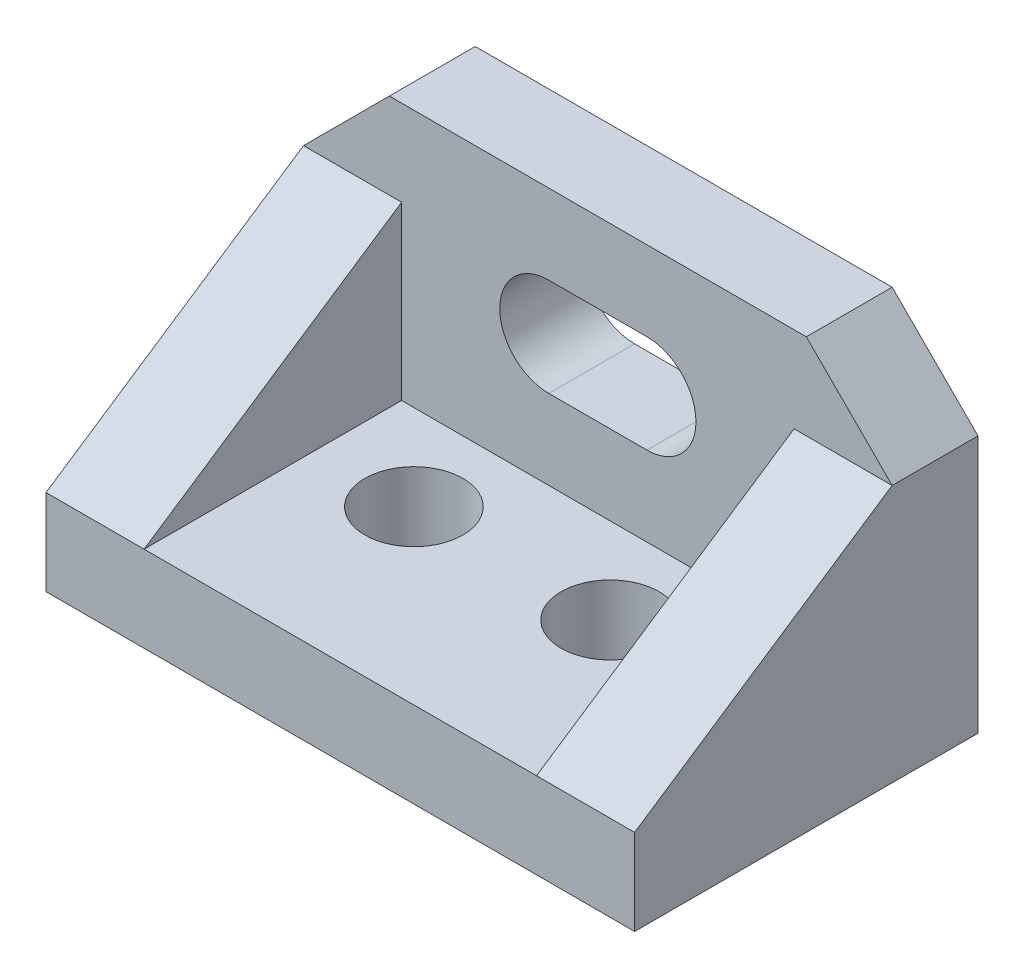
ISO-10303-21;
HEADER;
FILE_DESCRIPTION(('STEP AP214'),'2;1');
FILE_NAME('part.step','',(''),(''),'','','');
FILE_SCHEMA(('AUTOMOTIVE_DESIGN { 1 0 10303 214 1 1 1 1 }'));
ENDSEC;
DATA;
#1=APPLICATION_CONTEXT('core data for automotive mechanical design processes');
#2=APPLICATION_PROTOCOL_DEFINITION('international standard','automotive_design',2000,#1);
#3=PRODUCT_CONTEXT('',#1,'mechanical');
#4=PRODUCT('Part','Part','',(#3));
#5=PRODUCT_RELATED_PRODUCT_CATEGORY('part','',(#4));
#6=PRODUCT_DEFINITION_FORMATION('','',#4);
#7=PRODUCT_DEFINITION_CONTEXT('part definition',#1,'design');
#8=PRODUCT_DEFINITION('design','',#6,#7);
#9=PRODUCT_DEFINITION_SHAPE('','',#8);
#10=(LENGTH_UNIT() NAMED_UNIT(*) SI_UNIT(.MILLI.,.METRE.));
#11=(NAMED_UNIT(*) PLANE_ANGLE_UNIT() SI_UNIT($,.RADIAN.));
#12=(NAMED_UNIT(*) SI_UNIT($,.STERADIAN.) SOLID_ANGLE_UNIT());
#13=UNCERTAINTY_MEASURE_WITH_UNIT(LENGTH_MEASURE(1.E-05),#10,'distance_accuracy_value','');
#14=(GEOMETRIC_REPRESENTATION_CONTEXT(3) GLOBAL_UNCERTAINTY_ASSIGNED_CONTEXT((#13)) GLOBAL_UNIT_ASSIGNED_CONTEXT((#10,
#11,#12)) REPRESENTATION_CONTEXT('',''));
#15=CARTESIAN_POINT('',(0.,0.,0.));
#16=DIRECTION('',(0.,0.,1.));
#17=DIRECTION('',(1.,0.,0.));
#18=AXIS2_PLACEMENT_3D('',#15,#16,#17);
#19=CARTESIAN_POINT('',(0.,22.225,0.));
#20=DIRECTION('',(0.,-1.,0.));
#21=DIRECTION('',(0.,0.,-1.));
#22=AXIS2_PLACEMENT_3D('',#19,#20,#21);
#23=PLANE('',#22);
#24=CARTESIAN_POINT('',(50.8,22.225,-44.45));
#25=DIRECTION('',(0.,1.,0.));
#26=DIRECTION('',(0.,0.,1.));
#27=AXIS2_PLACEMENT_3D('',#24,#25,#26);
#28=CIRCLE('',#27,12.7);
#29=CARTESIAN_POINT('',(50.8,22.225,-31.75));
#30=VERTEX_POINT('',#29);
#31=EDGE_CURVE('E199',#30,#30,#28,.T.);
#32=ORIENTED_EDGE('',*,*,#31,.F.);
#33=EDGE_LOOP('',(#32));
#34=FACE_BOUND('',#33,.T.);
#35=CARTESIAN_POINT('',(101.6,22.225,-44.45));
#36=DIRECTION('',(0.,1.,0.));
#37=DIRECTION('',(0.,0.,1.));
#38=AXIS2_PLACEMENT_3D('',#35,#36,#37);
#39=CIRCLE('',#38,12.7);
#40=CARTESIAN_POINT('',(101.6,22.225,-31.75));
#41=VERTEX_POINT('',#40);
#42=EDGE_CURVE('E203',#41,#41,#39,.T.);
#43=ORIENTED_EDGE('',*,*,#42,.F.);
#44=EDGE_LOOP('',(#43));
#45=FACE_BOUND('',#44,.T.);
#46=DIRECTION('',(1.,0.,0.));
#47=VECTOR('',#46,1.);
#48=CARTESIAN_POINT('',(0.,22.225,-66.675));
#49=LINE('',#48,#47);
#50=CARTESIAN_POINT('',(25.4,22.225,-66.675));
#51=VERTEX_POINT('',#50);
#52=CARTESIAN_POINT('',(127.,22.225,-66.675));
#53=VERTEX_POINT('',#52);
#54=EDGE_CURVE('E235',#51,#53,#49,.T.);
#55=ORIENTED_EDGE('',*,*,#54,.F.);
#56=DIRECTION('',(0.,0.,-1.));
#57=VECTOR('',#56,1.);
#58=CARTESIAN_POINT('',(25.4,22.225,0.));
#59=LINE('',#58,#57);
#60=CARTESIAN_POINT('',(25.4,22.225,0.));
#61=VERTEX_POINT('',#60);
#62=EDGE_CURVE('E277',#61,#51,#59,.T.);
#63=ORIENTED_EDGE('',*,*,#62,.F.);
#64=DIRECTION('',(1.,0.,0.));
#65=VECTOR('',#64,1.);
#66=CARTESIAN_POINT('',(152.4,22.225,0.));
#67=LINE('',#66,#65);
#68=CARTESIAN_POINT('',(127.,22.225,0.));
#69=VERTEX_POINT('',#68);
#70=EDGE_CURVE('E292',#61,#69,#67,.T.);
#71=ORIENTED_EDGE('',*,*,#70,.T.);
#72=DIRECTION('',(0.,0.,1.));
#73=VECTOR('',#72,1.);
#74=CARTESIAN_POINT('',(127.,22.225,-66.675));
#75=LINE('',#74,#73);
#76=EDGE_CURVE('E273',#53,#69,#75,.T.);
#77=ORIENTED_EDGE('',*,*,#76,.F.);
#78=EDGE_LOOP('',(#55,#63,#71,#77));
#79=FACE_BOUND('',#78,.T.);
#80=ADVANCED_FACE('F45',(#34,#45,#79),#23,.F.);
#81=CARTESIAN_POINT('',(152.4,22.225,0.));
#82=DIRECTION('',(0.,0.,-1.));
#83=DIRECTION('',(-1.,0.,0.));
#84=AXIS2_PLACEMENT_3D('',#81,#82,#83);
#85=PLANE('',#84);
#86=DIRECTION('',(0.,-1.,0.));
#87=VECTOR('',#86,1.);
#88=CARTESIAN_POINT('',(152.4,22.225,0.));
#89=LINE('',#88,#87);
#90=CARTESIAN_POINT('',(152.4,22.225,0.));
#91=VERTEX_POINT('',#90);
#92=CARTESIAN_POINT('',(152.4,0.,0.));
#93=VERTEX_POINT('',#92);
#94=EDGE_CURVE('E11',#91,#93,#89,.T.);
#95=ORIENTED_EDGE('',*,*,#94,.F.);
#96=DIRECTION('',(1.,0.,0.));
#97=VECTOR('',#96,1.);
#98=CARTESIAN_POINT('',(0.,22.225,0.));
#99=LINE('',#98,#97);
#100=EDGE_CURVE('E253',#69,#91,#99,.T.);
#101=ORIENTED_EDGE('',*,*,#100,.F.);
#102=ORIENTED_EDGE('',*,*,#70,.F.);
#103=CARTESIAN_POINT('',(0.,22.225,0.));
#104=VERTEX_POINT('',#103);
#105=EDGE_CURVE('E257',#104,#61,#99,.T.);
#106=ORIENTED_EDGE('',*,*,#105,.F.);
#107=DIRECTION('',(0.,-1.,0.));
#108=VECTOR('',#107,1.);
#109=CARTESIAN_POINT('',(0.,22.225,0.));
#110=LINE('',#109,#108);
#111=CARTESIAN_POINT('',(0.,0.,0.));
#112=VERTEX_POINT('',#111);
#113=EDGE_CURVE('E296',#104,#112,#110,.T.);
#114=ORIENTED_EDGE('',*,*,#113,.T.);
#115=DIRECTION('',(1.,0.,0.));
#116=VECTOR('',#115,1.);
#117=CARTESIAN_POINT('',(152.4,0.,0.));
#118=LINE('',#117,#116);
#119=EDGE_CURVE('E291',#112,#93,#118,.T.);
#120=ORIENTED_EDGE('',*,*,#119,.T.);
#121=EDGE_LOOP('',(#95,#101,#102,#106,#114,#120));
#122=FACE_BOUND('',#121,.T.);
#123=ADVANCED_FACE('F47',(#122),#85,.F.);
#124=CARTESIAN_POINT('',(152.4,22.225,-88.9));
#125=DIRECTION('',(-1.,0.,0.));
#126=DIRECTION('',(0.,0.,1.));
#127=AXIS2_PLACEMENT_3D('',#124,#125,#126);
#128=PLANE('',#127);
#129=DIRECTION('',(0.,-1.,0.));
#130=VECTOR('',#129,1.);
#131=CARTESIAN_POINT('',(152.4,22.225,-88.9));
#132=LINE('',#131,#130);
#133=CARTESIAN_POINT('',(152.4,66.675,-88.9));
#134=VERTEX_POINT('',#133);
#135=CARTESIAN_POINT('',(152.4,0.,-88.9));
#136=VERTEX_POINT('',#135);
#137=EDGE_CURVE('E54',#134,#136,#132,.T.);
#138=ORIENTED_EDGE('',*,*,#137,.F.);
#139=DIRECTION('',(0.,0.,1.));
#140=VECTOR('',#139,1.);
#141=CARTESIAN_POINT('',(152.4,66.675,-88.9));
#142=LINE('',#141,#140);
#143=CARTESIAN_POINT('',(152.4,66.675,-66.675));
#144=VERTEX_POINT('',#143);
#145=EDGE_CURVE('E228',#134,#144,#142,.T.);
#146=ORIENTED_EDGE('',*,*,#145,.T.);
#147=DIRECTION('',(0.,0.554700196225229,-0.832050294337844));
#148=VECTOR('',#147,1.);
#149=CARTESIAN_POINT('',(152.4,66.675,-66.675));
#150=LINE('',#149,#148);
#151=EDGE_CURVE('E246',#91,#144,#150,.T.);
#152=ORIENTED_EDGE('',*,*,#151,.F.);
#153=ORIENTED_EDGE('',*,*,#94,.T.);
#154=DIRECTION('',(0.,0.,-1.));
#155=VECTOR('',#154,1.);
#156=CARTESIAN_POINT('',(152.4,0.,-88.9));
#157=LINE('',#156,#155);
#158=EDGE_CURVE('E301',#93,#136,#157,.T.);
#159=ORIENTED_EDGE('',*,*,#158,.T.);
#160=EDGE_LOOP('',(#138,#146,#152,#153,#159));
#161=FACE_BOUND('',#160,.T.);
#162=ADVANCED_FACE('F327',(#161),#128,.F.);
#163=CARTESIAN_POINT('',(0.,22.225,-88.9));
#164=DIRECTION('',(0.,0.,1.));
#165=DIRECTION('',(1.,0.,0.));
#166=AXIS2_PLACEMENT_3D('',#163,#164,#165);
#167=PLANE('',#166);
#168=CARTESIAN_POINT('',(63.5,55.5625,-88.9));
#169=DIRECTION('',(0.,0.,1.));
#170=DIRECTION('',(1.,0.,0.));
#171=AXIS2_PLACEMENT_3D('',#168,#169,#170);
#172=CIRCLE('',#171,12.7);
#173=CARTESIAN_POINT('',(63.5,68.2625,-88.9));
#174=VERTEX_POINT('',#173);
#175=CARTESIAN_POINT('',(63.5,42.8625,-88.9));
#176=VERTEX_POINT('',#175);
#177=EDGE_CURVE('E152',#174,#176,#172,.T.);
#178=ORIENTED_EDGE('',*,*,#177,.T.);
#179=DIRECTION('',(1.,0.,0.));
#180=VECTOR('',#179,1.);
#181=CARTESIAN_POINT('',(0.,42.8625,-88.9));
#182=LINE('',#181,#180);
#183=CARTESIAN_POINT('',(88.9,42.8625,-88.9));
#184=VERTEX_POINT('',#183);
#185=EDGE_CURVE('E148',#176,#184,#182,.T.);
#186=ORIENTED_EDGE('',*,*,#185,.T.);
#187=CARTESIAN_POINT('',(88.9,55.5625,-88.9));
#188=DIRECTION('',(0.,0.,1.));
#189=DIRECTION('',(1.,0.,0.));
#190=AXIS2_PLACEMENT_3D('',#187,#188,#189);
#191=CIRCLE('',#190,12.7);
#192=CARTESIAN_POINT('',(88.9,68.2625,-88.9));
#193=VERTEX_POINT('',#192);
#194=EDGE_CURVE('E155',#184,#193,#191,.T.);
#195=ORIENTED_EDGE('',*,*,#194,.T.);
#196=DIRECTION('',(1.,0.,0.));
#197=VECTOR('',#196,1.);
#198=CARTESIAN_POINT('',(0.,68.2625,-88.9));
#199=LINE('',#198,#197);
#200=EDGE_CURVE('E160',#174,#193,#199,.T.);
#201=ORIENTED_EDGE('',*,*,#200,.F.);
#202=EDGE_LOOP('',(#178,#186,#195,#201));
#203=FACE_BOUND('',#202,.T.);
#204=DIRECTION('',(0.,-1.,0.));
#205=VECTOR('',#204,1.);
#206=CARTESIAN_POINT('',(0.,22.225,-88.9));
#207=LINE('',#206,#205);
#208=CARTESIAN_POINT('',(0.,66.675,-88.9));
#209=VERTEX_POINT('',#208);
#210=CARTESIAN_POINT('',(0.,0.,-88.9));
#211=VERTEX_POINT('',#210);
#212=EDGE_CURVE('E314',#209,#211,#207,.T.);
#213=ORIENTED_EDGE('',*,*,#212,.F.);
#214=DIRECTION('',(0.707106781186546,0.707106781186549,0.));
#215=VECTOR('',#214,1.);
#216=CARTESIAN_POINT('',(22.2249999999999,88.9,-88.9));
#217=LINE('',#216,#215);
#218=CARTESIAN_POINT('',(22.2249999999999,88.9,-88.9));
#219=VERTEX_POINT('',#218);
#220=EDGE_CURVE('E210',#209,#219,#217,.T.);
#221=ORIENTED_EDGE('',*,*,#220,.T.);
#222=DIRECTION('',(-1.,0.,0.));
#223=VECTOR('',#222,1.);
#224=CARTESIAN_POINT('',(152.4,88.9,-88.9));
#225=LINE('',#224,#223);
#226=CARTESIAN_POINT('',(130.175,88.9,-88.9));
#227=VERTEX_POINT('',#226);
#228=EDGE_CURVE('E239',#227,#219,#225,.T.);
#229=ORIENTED_EDGE('',*,*,#228,.F.);
#230=DIRECTION('',(0.707106781186551,-0.707106781186543,0.));
#231=VECTOR('',#230,1.);
#232=CARTESIAN_POINT('',(130.175,88.9,-88.9));
#233=LINE('',#232,#231);
#234=EDGE_CURVE('E224',#227,#134,#233,.T.);
#235=ORIENTED_EDGE('',*,*,#234,.T.);
#236=ORIENTED_EDGE('',*,*,#137,.T.);
#237=DIRECTION('',(-1.,0.,0.));
#238=VECTOR('',#237,1.);
#239=CARTESIAN_POINT('',(0.,0.,-88.9));
#240=LINE('',#239,#238);
#241=EDGE_CURVE('E305',#136,#211,#240,.T.);
#242=ORIENTED_EDGE('',*,*,#241,.T.);
#243=EDGE_LOOP('',(#213,#221,#229,#235,#236,#242));
#244=FACE_BOUND('',#243,.T.);
#245=ADVANCED_FACE('F162',(#203,#244),#167,.F.);
#246=CARTESIAN_POINT('',(0.,22.225,0.));
#247=DIRECTION('',(1.,0.,0.));
#248=DIRECTION('',(0.,0.,-1.));
#249=AXIS2_PLACEMENT_3D('',#246,#247,#248);
#250=PLANE('',#249);
#251=DIRECTION('',(0.,0.554700196225229,-0.832050294337844));
#252=VECTOR('',#251,1.);
#253=CARTESIAN_POINT('',(0.,66.675,-66.675));
#254=LINE('',#253,#252);
#255=CARTESIAN_POINT('',(0.,66.675,-66.675));
#256=VERTEX_POINT('',#255);
#257=EDGE_CURVE('E249',#104,#256,#254,.T.);
#258=ORIENTED_EDGE('',*,*,#257,.T.);
#259=DIRECTION('',(0.,0.,1.));
#260=VECTOR('',#259,1.);
#261=CARTESIAN_POINT('',(0.,66.675,-88.9));
#262=LINE('',#261,#260);
#263=EDGE_CURVE('E214',#209,#256,#262,.T.);
#264=ORIENTED_EDGE('',*,*,#263,.F.);
#265=ORIENTED_EDGE('',*,*,#212,.T.);
#266=DIRECTION('',(0.,0.,1.));
#267=VECTOR('',#266,1.);
#268=CARTESIAN_POINT('',(0.,0.,0.));
#269=LINE('',#268,#267);
#270=EDGE_CURVE('E297',#211,#112,#269,.T.);
#271=ORIENTED_EDGE('',*,*,#270,.T.);
#272=ORIENTED_EDGE('',*,*,#113,.F.);
#273=EDGE_LOOP('',(#258,#264,#265,#271,#272));
#274=FACE_BOUND('',#273,.T.);
#275=ADVANCED_FACE('F336',(#274),#250,.F.);
#276=CARTESIAN_POINT('',(0.,0.,0.));
#277=DIRECTION('',(0.,-1.,0.));
#278=DIRECTION('',(0.,0.,-1.));
#279=AXIS2_PLACEMENT_3D('',#276,#277,#278);
#280=PLANE('',#279);
#281=CARTESIAN_POINT('',(50.8,0.,-44.45));
#282=DIRECTION('',(0.,1.,0.));
#283=DIRECTION('',(0.,0.,1.));
#284=AXIS2_PLACEMENT_3D('',#281,#282,#283);
#285=CIRCLE('',#284,12.7);
#286=CARTESIAN_POINT('',(50.8,0.,-31.75));
#287=VERTEX_POINT('',#286);
#288=EDGE_CURVE('E194',#287,#287,#285,.T.);
#289=ORIENTED_EDGE('',*,*,#288,.T.);
#290=EDGE_LOOP('',(#289));
#291=FACE_BOUND('',#290,.T.);
#292=CARTESIAN_POINT('',(101.6,0.,-44.45));
#293=DIRECTION('',(0.,1.,0.));
#294=DIRECTION('',(0.,0.,1.));
#295=AXIS2_PLACEMENT_3D('',#292,#293,#294);
#296=CIRCLE('',#295,12.7);
#297=CARTESIAN_POINT('',(101.6,0.,-31.75));
#298=VERTEX_POINT('',#297);
#299=EDGE_CURVE('E188',#298,#298,#296,.T.);
#300=ORIENTED_EDGE('',*,*,#299,.T.);
#301=EDGE_LOOP('',(#300));
#302=FACE_BOUND('',#301,.T.);
#303=ORIENTED_EDGE('',*,*,#119,.F.);
#304=ORIENTED_EDGE('',*,*,#270,.F.);
#305=ORIENTED_EDGE('',*,*,#241,.F.);
#306=ORIENTED_EDGE('',*,*,#158,.F.);
#307=EDGE_LOOP('',(#303,#304,#305,#306));
#308=FACE_BOUND('',#307,.T.);
#309=ADVANCED_FACE('F326',(#291,#302,#308),#280,.T.);
#310=CARTESIAN_POINT('',(25.4,66.675,0.));
#311=DIRECTION('',(-1.,0.,0.));
#312=DIRECTION('',(0.,0.,1.));
#313=AXIS2_PLACEMENT_3D('',#310,#311,#312);
#314=PLANE('',#313);
#315=DIRECTION('',(0.,-1.,0.));
#316=VECTOR('',#315,1.);
#317=CARTESIAN_POINT('',(25.4,66.675,-66.675));
#318=LINE('',#317,#316);
#319=CARTESIAN_POINT('',(25.4,66.675,-66.675));
#320=VERTEX_POINT('',#319);
#321=EDGE_CURVE('E285',#320,#51,#318,.T.);
#322=ORIENTED_EDGE('',*,*,#321,.F.);
#323=DIRECTION('',(0.,-0.554700196225229,0.832050294337844));
#324=VECTOR('',#323,1.);
#325=CARTESIAN_POINT('',(25.4,35.9019230769231,-20.5153846153846));
#326=LINE('',#325,#324);
#327=EDGE_CURVE('E264',#320,#61,#326,.T.);
#328=ORIENTED_EDGE('',*,*,#327,.T.);
#329=ORIENTED_EDGE('',*,*,#62,.T.);
#330=EDGE_LOOP('',(#322,#328,#329));
#331=FACE_BOUND('',#330,.T.);
#332=ADVANCED_FACE('F361',(#331),#314,.F.);
#333=CARTESIAN_POINT('',(127.,66.675,-66.675));
#334=DIRECTION('',(1.,0.,0.));
#335=DIRECTION('',(0.,0.,-1.));
#336=AXIS2_PLACEMENT_3D('',#333,#334,#335);
#337=PLANE('',#336);
#338=ORIENTED_EDGE('',*,*,#76,.T.);
#339=DIRECTION('',(0.,0.554700196225229,-0.832050294337844));
#340=VECTOR('',#339,1.);
#341=CARTESIAN_POINT('',(127.,66.675,-66.675));
#342=LINE('',#341,#340);
#343=CARTESIAN_POINT('',(127.,66.675,-66.675));
#344=VERTEX_POINT('',#343);
#345=EDGE_CURVE('E260',#69,#344,#342,.T.);
#346=ORIENTED_EDGE('',*,*,#345,.T.);
#347=DIRECTION('',(0.,-1.,0.));
#348=VECTOR('',#347,1.);
#349=CARTESIAN_POINT('',(127.,66.675,-66.675));
#350=LINE('',#349,#348);
#351=EDGE_CURVE('E268',#344,#53,#350,.T.);
#352=ORIENTED_EDGE('',*,*,#351,.T.);
#353=EDGE_LOOP('',(#338,#346,#352));
#354=FACE_BOUND('',#353,.T.);
#355=ADVANCED_FACE('F354',(#354),#337,.F.);
#356=CARTESIAN_POINT('',(0.,66.675,-66.675));
#357=DIRECTION('',(0.,-0.832050294337844,-0.554700196225229));
#358=DIRECTION('',(0.,0.554700196225229,-0.832050294337844));
#359=AXIS2_PLACEMENT_3D('',#356,#357,#358);
#360=PLANE('',#359);
#361=ORIENTED_EDGE('',*,*,#100,.T.);
#362=ORIENTED_EDGE('',*,*,#151,.T.);
#363=DIRECTION('',(-1.,0.,0.));
#364=VECTOR('',#363,1.);
#365=CARTESIAN_POINT('',(152.4,66.675,-66.675));
#366=LINE('',#365,#364);
#367=EDGE_CURVE('E272',#144,#344,#366,.T.);
#368=ORIENTED_EDGE('',*,*,#367,.T.);
#369=ORIENTED_EDGE('',*,*,#345,.F.);
#370=EDGE_LOOP('',(#361,#362,#368,#369));
#371=FACE_BOUND('',#370,.T.);
#372=ADVANCED_FACE('F351',(#371),#360,.F.);
#373=DIRECTION('',(-1.,0.,0.));
#374=VECTOR('',#373,1.);
#375=CARTESIAN_POINT('',(25.4,66.675,-66.675));
#376=LINE('',#375,#374);
#377=EDGE_CURVE('E281',#320,#256,#376,.T.);
#378=ORIENTED_EDGE('',*,*,#377,.T.);
#379=ORIENTED_EDGE('',*,*,#257,.F.);
#380=ORIENTED_EDGE('',*,*,#105,.T.);
#381=ORIENTED_EDGE('',*,*,#327,.F.);
#382=EDGE_LOOP('',(#378,#379,#380,#381));
#383=FACE_BOUND('',#382,.T.);
#384=ADVANCED_FACE('F364',(#383),#360,.F.);
#385=CARTESIAN_POINT('',(0.,88.9,-66.675));
#386=DIRECTION('',(0.,0.,-1.));
#387=DIRECTION('',(-1.,0.,0.));
#388=AXIS2_PLACEMENT_3D('',#385,#386,#387);
#389=PLANE('',#388);
#390=CARTESIAN_POINT('',(88.9,55.5625,-66.675));
#391=DIRECTION('',(0.,0.,1.));
#392=DIRECTION('',(1.,0.,0.));
#393=AXIS2_PLACEMENT_3D('',#390,#391,#392);
#394=CIRCLE('',#393,12.7);
#395=CARTESIAN_POINT('',(88.9,42.8625,-66.675));
#396=VERTEX_POINT('',#395);
#397=CARTESIAN_POINT('',(88.9,68.2625,-66.675));
#398=VERTEX_POINT('',#397);
#399=EDGE_CURVE('E179',#396,#398,#394,.T.);
#400=ORIENTED_EDGE('',*,*,#399,.F.);
#401=DIRECTION('',(1.,0.,0.));
#402=VECTOR('',#401,1.);
#403=CARTESIAN_POINT('',(0.,42.8625,-66.675));
#404=LINE('',#403,#402);
#405=CARTESIAN_POINT('',(63.5,42.8625,-66.675));
#406=VERTEX_POINT('',#405);
#407=EDGE_CURVE('E69',#406,#396,#404,.T.);
#408=ORIENTED_EDGE('',*,*,#407,.F.);
#409=CARTESIAN_POINT('',(63.5,55.5625,-66.675));
#410=DIRECTION('',(0.,0.,1.));
#411=DIRECTION('',(1.,0.,0.));
#412=AXIS2_PLACEMENT_3D('',#409,#410,#411);
#413=CIRCLE('',#412,12.7);
#414=CARTESIAN_POINT('',(63.5,68.2625,-66.675));
#415=VERTEX_POINT('',#414);
#416=EDGE_CURVE('E166',#415,#406,#413,.T.);
#417=ORIENTED_EDGE('',*,*,#416,.F.);
#418=DIRECTION('',(1.,0.,0.));
#419=VECTOR('',#418,1.);
#420=CARTESIAN_POINT('',(0.,68.2625,-66.675));
#421=LINE('',#420,#419);
#422=EDGE_CURVE('E170',#415,#398,#421,.T.);
#423=ORIENTED_EDGE('',*,*,#422,.T.);
#424=EDGE_LOOP('',(#400,#408,#417,#423));
#425=FACE_BOUND('',#424,.T.);
#426=DIRECTION('',(1.,0.,0.));
#427=VECTOR('',#426,1.);
#428=CARTESIAN_POINT('',(0.,88.9,-66.675));
#429=LINE('',#428,#427);
#430=CARTESIAN_POINT('',(22.2249999999999,88.9,-66.675));
#431=VERTEX_POINT('',#430);
#432=CARTESIAN_POINT('',(130.175,88.9,-66.675));
#433=VERTEX_POINT('',#432);
#434=EDGE_CURVE('E243',#431,#433,#429,.T.);
#435=ORIENTED_EDGE('',*,*,#434,.F.);
#436=DIRECTION('',(0.707106781186546,0.707106781186549,0.));
#437=VECTOR('',#436,1.);
#438=CARTESIAN_POINT('',(22.2249999999999,88.9,-66.675));
#439=LINE('',#438,#437);
#440=EDGE_CURVE('E198',#256,#431,#439,.T.);
#441=ORIENTED_EDGE('',*,*,#440,.F.);
#442=ORIENTED_EDGE('',*,*,#377,.F.);
#443=ORIENTED_EDGE('',*,*,#321,.T.);
#444=ORIENTED_EDGE('',*,*,#54,.T.);
#445=ORIENTED_EDGE('',*,*,#351,.F.);
#446=ORIENTED_EDGE('',*,*,#367,.F.);
#447=DIRECTION('',(0.707106781186551,-0.707106781186543,0.));
#448=VECTOR('',#447,1.);
#449=CARTESIAN_POINT('',(130.175,88.9,-66.675));
#450=LINE('',#449,#448);
#451=EDGE_CURVE('E221',#433,#144,#450,.T.);
#452=ORIENTED_EDGE('',*,*,#451,.F.);
#453=EDGE_LOOP('',(#435,#441,#442,#443,#444,#445,#446,#452));
#454=FACE_BOUND('',#453,.T.);
#455=ADVANCED_FACE('F348',(#425,#454),#389,.F.);
#456=CARTESIAN_POINT('',(0.,88.9,0.));
#457=DIRECTION('',(0.,1.,0.));
#458=DIRECTION('',(0.,0.,1.));
#459=AXIS2_PLACEMENT_3D('',#456,#457,#458);
#460=PLANE('',#459);
#461=DIRECTION('',(0.,0.,1.));
#462=VECTOR('',#461,1.);
#463=CARTESIAN_POINT('',(22.2249999999999,88.9,-88.9));
#464=LINE('',#463,#462);
#465=EDGE_CURVE('E217',#219,#431,#464,.T.);
#466=ORIENTED_EDGE('',*,*,#465,.T.);
#467=ORIENTED_EDGE('',*,*,#434,.T.);
#468=DIRECTION('',(0.,0.,1.));
#469=VECTOR('',#468,1.);
#470=CARTESIAN_POINT('',(130.175,88.9,-88.9));
#471=LINE('',#470,#469);
#472=EDGE_CURVE('E231',#227,#433,#471,.T.);
#473=ORIENTED_EDGE('',*,*,#472,.F.);
#474=ORIENTED_EDGE('',*,*,#228,.T.);
#475=EDGE_LOOP('',(#466,#467,#473,#474));
#476=FACE_BOUND('',#475,.T.);
#477=ADVANCED_FACE('F341',(#476),#460,.T.);
#478=CARTESIAN_POINT('',(130.175,88.9,-88.9));
#479=DIRECTION('',(-0.707106781186543,-0.707106781186552,0.));
#480=DIRECTION('',(0.707106781186552,-0.707106781186543,0.));
#481=AXIS2_PLACEMENT_3D('',#478,#479,#480);
#482=PLANE('',#481);
#483=ORIENTED_EDGE('',*,*,#451,.T.);
#484=ORIENTED_EDGE('',*,*,#145,.F.);
#485=ORIENTED_EDGE('',*,*,#234,.F.);
#486=ORIENTED_EDGE('',*,*,#472,.T.);
#487=EDGE_LOOP('',(#483,#484,#485,#486));
#488=FACE_BOUND('',#487,.T.);
#489=ADVANCED_FACE('F345',(#488),#482,.F.);
#490=CARTESIAN_POINT('',(22.2249999999999,88.9,-88.9));
#491=DIRECTION('',(0.707106781186549,-0.707106781186546,0.));
#492=DIRECTION('',(0.707106781186546,0.707106781186549,0.));
#493=AXIS2_PLACEMENT_3D('',#490,#491,#492);
#494=PLANE('',#493);
#495=ORIENTED_EDGE('',*,*,#440,.T.);
#496=ORIENTED_EDGE('',*,*,#465,.F.);
#497=ORIENTED_EDGE('',*,*,#220,.F.);
#498=ORIENTED_EDGE('',*,*,#263,.T.);
#499=EDGE_LOOP('',(#495,#496,#497,#498));
#500=FACE_BOUND('',#499,.T.);
#501=ADVANCED_FACE('F365',(#500),#494,.F.);
#502=CARTESIAN_POINT('',(101.6,0.,-44.45));
#503=DIRECTION('',(0.,1.,0.));
#504=DIRECTION('',(0.,0.,1.));
#505=AXIS2_PLACEMENT_3D('',#502,#503,#504);
#506=CYLINDRICAL_SURFACE('',#505,12.7);
#507=ORIENTED_EDGE('',*,*,#299,.F.);
#508=EDGE_LOOP('',(#507));
#509=FACE_BOUND('',#508,.T.);
#510=ORIENTED_EDGE('',*,*,#42,.T.);
#511=EDGE_LOOP('',(#510));
#512=FACE_BOUND('',#511,.T.);
#513=ADVANCED_FACE('F367',(#509,#512),#506,.F.);
#514=CARTESIAN_POINT('',(50.8,0.,-44.45));
#515=DIRECTION('',(0.,1.,0.));
#516=DIRECTION('',(0.,0.,1.));
#517=AXIS2_PLACEMENT_3D('',#514,#515,#516);
#518=CYLINDRICAL_SURFACE('',#517,12.7);
#519=ORIENTED_EDGE('',*,*,#288,.F.);
#520=EDGE_LOOP('',(#519));
#521=FACE_BOUND('',#520,.T.);
#522=ORIENTED_EDGE('',*,*,#31,.T.);
#523=EDGE_LOOP('',(#522));
#524=FACE_BOUND('',#523,.T.);
#525=ADVANCED_FACE('F374',(#521,#524),#518,.F.);
#526=CARTESIAN_POINT('',(0.,42.8625,-88.9));
#527=DIRECTION('',(0.,-1.,0.));
#528=DIRECTION('',(0.,0.,-1.));
#529=AXIS2_PLACEMENT_3D('',#526,#527,#528);
#530=PLANE('',#529);
#531=ORIENTED_EDGE('',*,*,#407,.T.);
#532=DIRECTION('',(0.,0.,1.));
#533=VECTOR('',#532,1.);
#534=CARTESIAN_POINT('',(88.9,42.8625,-88.9));
#535=LINE('',#534,#533);
#536=EDGE_CURVE('E145',#184,#396,#535,.T.);
#537=ORIENTED_EDGE('',*,*,#536,.F.);
#538=ORIENTED_EDGE('',*,*,#185,.F.);
#539=DIRECTION('',(0.,0.,1.));
#540=VECTOR('',#539,1.);
#541=CARTESIAN_POINT('',(63.5,42.8625,-88.9));
#542=LINE('',#541,#540);
#543=EDGE_CURVE('E185',#176,#406,#542,.T.);
#544=ORIENTED_EDGE('',*,*,#543,.T.);
#545=EDGE_LOOP('',(#531,#537,#538,#544));
#546=FACE_BOUND('',#545,.T.);
#547=ADVANCED_FACE('F146',(#546),#530,.F.);
#548=CARTESIAN_POINT('',(63.5,55.5625,-88.9));
#549=DIRECTION('',(0.,0.,1.));
#550=DIRECTION('',(1.,0.,0.));
#551=AXIS2_PLACEMENT_3D('',#548,#549,#550);
#552=CYLINDRICAL_SURFACE('',#551,12.7);
#553=ORIENTED_EDGE('',*,*,#416,.T.);
#554=ORIENTED_EDGE('',*,*,#543,.F.);
#555=ORIENTED_EDGE('',*,*,#177,.F.);
#556=DIRECTION('',(0.,0.,1.));
#557=VECTOR('',#556,1.);
#558=CARTESIAN_POINT('',(63.5,68.2625,-88.9));
#559=LINE('',#558,#557);
#560=EDGE_CURVE('E189',#174,#415,#559,.T.);
#561=ORIENTED_EDGE('',*,*,#560,.T.);
#562=EDGE_LOOP('',(#553,#554,#555,#561));
#563=FACE_BOUND('',#562,.T.);
#564=ADVANCED_FACE('F452',(#563),#552,.F.);
#565=CARTESIAN_POINT('',(0.,68.2625,-88.9));
#566=DIRECTION('',(0.,-1.,0.));
#567=DIRECTION('',(0.,0.,-1.));
#568=AXIS2_PLACEMENT_3D('',#565,#566,#567);
#569=PLANE('',#568);
#570=ORIENTED_EDGE('',*,*,#422,.F.);
#571=ORIENTED_EDGE('',*,*,#560,.F.);
#572=ORIENTED_EDGE('',*,*,#200,.T.);
#573=DIRECTION('',(0.,0.,1.));
#574=VECTOR('',#573,1.);
#575=CARTESIAN_POINT('',(88.9,68.2625,-88.9));
#576=LINE('',#575,#574);
#577=EDGE_CURVE('E61',#193,#398,#576,.T.);
#578=ORIENTED_EDGE('',*,*,#577,.T.);
#579=EDGE_LOOP('',(#570,#571,#572,#578));
#580=FACE_BOUND('',#579,.T.);
#581=ADVANCED_FACE('F461',(#580),#569,.T.);
#582=CARTESIAN_POINT('',(88.9,55.5625,-88.9));
#583=DIRECTION('',(0.,0.,1.));
#584=DIRECTION('',(1.,0.,0.));
#585=AXIS2_PLACEMENT_3D('',#582,#583,#584);
#586=CYLINDRICAL_SURFACE('',#585,12.7);
#587=ORIENTED_EDGE('',*,*,#399,.T.);
#588=ORIENTED_EDGE('',*,*,#577,.F.);
#589=ORIENTED_EDGE('',*,*,#194,.F.);
#590=ORIENTED_EDGE('',*,*,#536,.T.);
#591=EDGE_LOOP('',(#587,#588,#589,#590));
#592=FACE_BOUND('',#591,.T.);
#593=ADVANCED_FACE('F156',(#592),#586,.F.);
#594=CLOSED_SHELL('',(#80,#123,#162,#245,#275,#309,#332,#355,#372,#384,#455,#477,#489,#501,#513,
#525,#547,#564,#581,#593));
#595=MANIFOLD_SOLID_BREP('B2',#594);
#596=ADVANCED_BREP_SHAPE_REPRESENTATION('',(#18,#595),#14);
#597=SHAPE_DEFINITION_REPRESENTATION(#9,#596);
ENDSEC;
END-ISO-10303-21;
